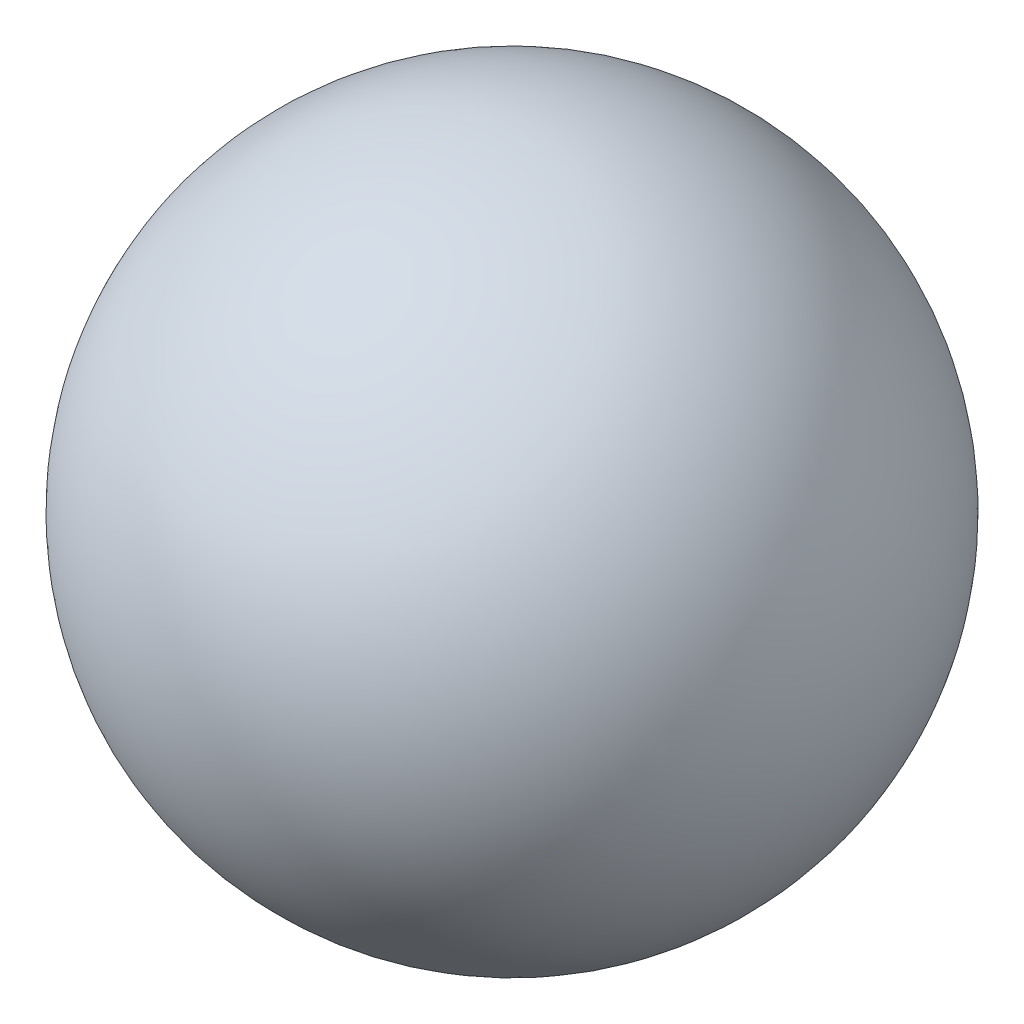
ISO-10303-21;
HEADER;
FILE_DESCRIPTION(('STEP AP214'),'2;1');
FILE_NAME('part.step','',(''),(''),'','','');
FILE_SCHEMA(('AUTOMOTIVE_DESIGN { 1 0 10303 214 1 1 1 1 }'));
ENDSEC;
DATA;
#1=APPLICATION_CONTEXT('core data for automotive mechanical design processes');
#2=APPLICATION_PROTOCOL_DEFINITION('international standard','automotive_design',2000,#1);
#3=PRODUCT_CONTEXT('',#1,'mechanical');
#4=PRODUCT('Part','Part','',(#3));
#5=PRODUCT_RELATED_PRODUCT_CATEGORY('part','',(#4));
#6=PRODUCT_DEFINITION_FORMATION('','',#4);
#7=PRODUCT_DEFINITION_CONTEXT('part definition',#1,'design');
#8=PRODUCT_DEFINITION('design','',#6,#7);
#9=PRODUCT_DEFINITION_SHAPE('','',#8);
#10=(LENGTH_UNIT() NAMED_UNIT(*) SI_UNIT(.MILLI.,.METRE.));
#11=(NAMED_UNIT(*) PLANE_ANGLE_UNIT() SI_UNIT($,.RADIAN.));
#12=(NAMED_UNIT(*) SI_UNIT($,.STERADIAN.) SOLID_ANGLE_UNIT());
#13=UNCERTAINTY_MEASURE_WITH_UNIT(LENGTH_MEASURE(1.E-05),#10,'distance_accuracy_value','');
#14=(GEOMETRIC_REPRESENTATION_CONTEXT(3) GLOBAL_UNCERTAINTY_ASSIGNED_CONTEXT((#13)) GLOBAL_UNIT_ASSIGNED_CONTEXT((#10,
#11,#12)) REPRESENTATION_CONTEXT('',''));
#15=CARTESIAN_POINT('',(0.,0.,0.));
#16=DIRECTION('',(0.,0.,1.));
#17=DIRECTION('',(1.,0.,0.));
#18=AXIS2_PLACEMENT_3D('',#15,#16,#17);
#19=CARTESIAN_POINT('',(21.336,0.,0.));
#20=DIRECTION('',(-1.,0.,0.));
#21=DIRECTION('',(0.,0.,-1.));
#22=AXIS2_PLACEMENT_3D('',#19,#20,#21);
#23=SPHERICAL_SURFACE('',#22,21.336);
#24=CARTESIAN_POINT('',(0.,0.,0.));
#25=VERTEX_POINT('',#24);
#26=VERTEX_LOOP('',#25);
#27=FACE_BOUND('',#26,.T.);
#28=ADVANCED_FACE('F29',(#27),#23,.T.);
#29=CLOSED_SHELL('',(#28));
#30=MANIFOLD_SOLID_BREP('B2',#29);
#31=ADVANCED_BREP_SHAPE_REPRESENTATION('',(#18,#30),#14);
#32=SHAPE_DEFINITION_REPRESENTATION(#9,#31);
ENDSEC;
END-ISO-10303-21;
